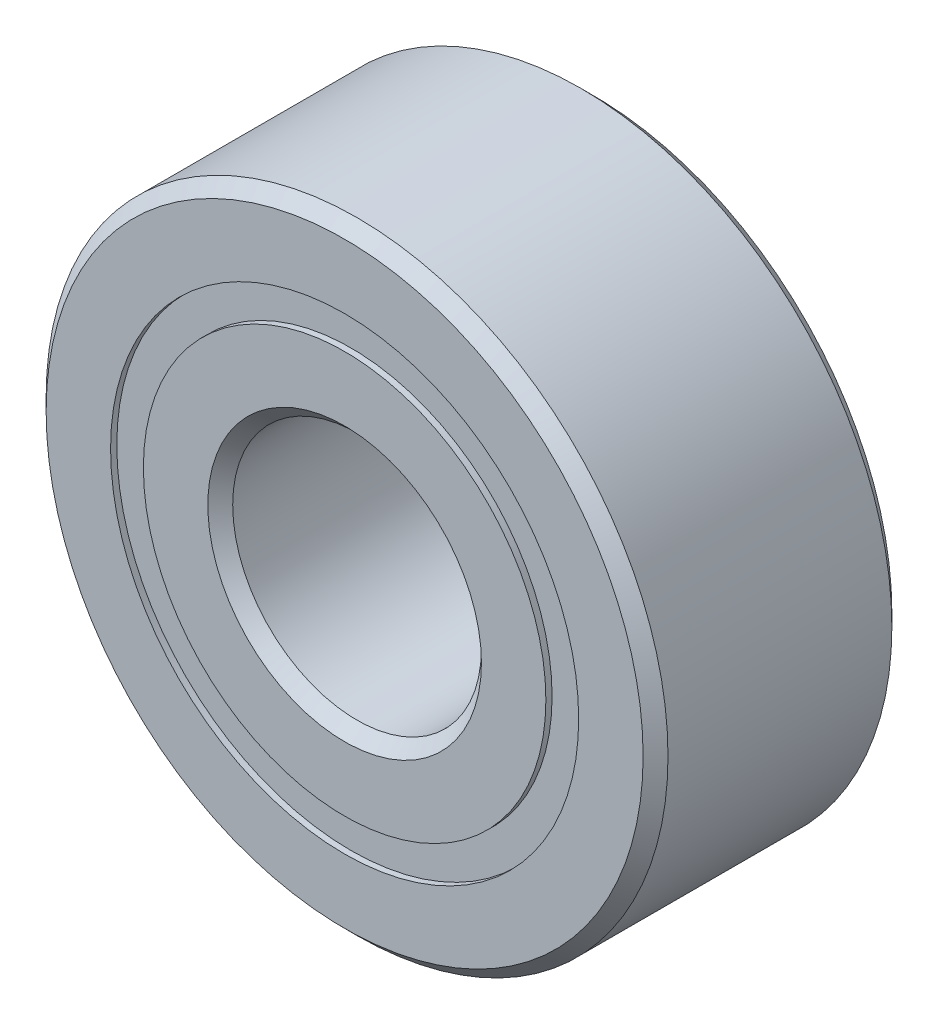
ISO-10303-21;
HEADER;
FILE_DESCRIPTION(('STEP AP214'),'2;1');
FILE_NAME('part.step','',(''),(''),'','','');
FILE_SCHEMA(('AUTOMOTIVE_DESIGN { 1 0 10303 214 1 1 1 1 }'));
ENDSEC;
DATA;
#1=APPLICATION_CONTEXT('core data for automotive mechanical design processes');
#2=APPLICATION_PROTOCOL_DEFINITION('international standard','automotive_design',2000,#1);
#3=PRODUCT_CONTEXT('',#1,'mechanical');
#4=PRODUCT('Part','Part','',(#3));
#5=PRODUCT_RELATED_PRODUCT_CATEGORY('part','',(#4));
#6=PRODUCT_DEFINITION_FORMATION('','',#4);
#7=PRODUCT_DEFINITION_CONTEXT('part definition',#1,'design');
#8=PRODUCT_DEFINITION('design','',#6,#7);
#9=PRODUCT_DEFINITION_SHAPE('','',#8);
#10=(LENGTH_UNIT() NAMED_UNIT(*) SI_UNIT(.MILLI.,.METRE.));
#11=(NAMED_UNIT(*) PLANE_ANGLE_UNIT() SI_UNIT($,.RADIAN.));
#12=(NAMED_UNIT(*) SI_UNIT($,.STERADIAN.) SOLID_ANGLE_UNIT());
#13=UNCERTAINTY_MEASURE_WITH_UNIT(LENGTH_MEASURE(1.E-05),#10,'distance_accuracy_value','');
#14=(GEOMETRIC_REPRESENTATION_CONTEXT(3) GLOBAL_UNCERTAINTY_ASSIGNED_CONTEXT((#13)) GLOBAL_UNIT_ASSIGNED_CONTEXT((#10,
#11,#12)) REPRESENTATION_CONTEXT('',''));
#15=CARTESIAN_POINT('',(0.,0.,0.));
#16=DIRECTION('',(0.,0.,1.));
#17=DIRECTION('',(1.,0.,0.));
#18=AXIS2_PLACEMENT_3D('',#15,#16,#17);
#19=CARTESIAN_POINT('',(0.,3.76373626373626,-1.9));
#20=DIRECTION('',(0.,0.,1.));
#21=DIRECTION('',(1.,0.,0.));
#22=AXIS2_PLACEMENT_3D('',#19,#20,#21);
#23=PLANE('',#22);
#24=CARTESIAN_POINT('',(0.,0.,-1.9));
#25=DIRECTION('',(0.,0.,1.));
#26=DIRECTION('',(1.,0.,0.));
#27=AXIS2_PLACEMENT_3D('',#24,#25,#26);
#28=CIRCLE('',#27,3.76373626373626);
#29=CARTESIAN_POINT('',(3.76373626373626,0.,-1.9));
#30=VERTEX_POINT('',#29);
#31=EDGE_CURVE('E57',#30,#30,#28,.T.);
#32=ORIENTED_EDGE('',*,*,#31,.F.);
#33=EDGE_LOOP('',(#32));
#34=FACE_BOUND('',#33,.T.);
#35=CARTESIAN_POINT('',(0.,0.,-1.9));
#36=DIRECTION('',(0.,0.,1.));
#37=DIRECTION('',(1.,0.,0.));
#38=AXIS2_PLACEMENT_3D('',#35,#36,#37);
#39=CIRCLE('',#38,3.23626373626374);
#40=CARTESIAN_POINT('',(3.23626373626374,0.,-1.9));
#41=VERTEX_POINT('',#40);
#42=EDGE_CURVE('E11',#41,#41,#39,.T.);
#43=ORIENTED_EDGE('',*,*,#42,.T.);
#44=EDGE_LOOP('',(#43));
#45=FACE_BOUND('',#44,.T.);
#46=ADVANCED_FACE('F43',(#34,#45),#23,.F.);
#47=CARTESIAN_POINT('',(0.,0.,2.));
#48=DIRECTION('',(0.,0.,1.));
#49=DIRECTION('',(1.,0.,0.));
#50=AXIS2_PLACEMENT_3D('',#47,#48,#49);
#51=CYLINDRICAL_SURFACE('',#50,3.23626373626374);
#52=ORIENTED_EDGE('',*,*,#42,.F.);
#53=EDGE_LOOP('',(#52));
#54=FACE_BOUND('',#53,.T.);
#55=CARTESIAN_POINT('',(0.,0.,-0.927189448602435));
#56=DIRECTION('',(0.,0.,1.));
#57=DIRECTION('',(1.,0.,0.));
#58=AXIS2_PLACEMENT_3D('',#55,#56,#57);
#59=CIRCLE('',#58,3.23626373626374);
#60=CARTESIAN_POINT('',(3.23626373626374,0.,-0.927189448602435));
#61=VERTEX_POINT('',#60);
#62=EDGE_CURVE('E49',#61,#61,#59,.T.);
#63=ORIENTED_EDGE('',*,*,#62,.T.);
#64=EDGE_LOOP('',(#63));
#65=FACE_BOUND('',#64,.T.);
#66=ADVANCED_FACE('F66',(#54,#65),#51,.F.);
#67=CARTESIAN_POINT('',(0.,3.76373626373626,-0.927189448602435));
#68=DIRECTION('',(0.,0.,-1.));
#69=DIRECTION('',(-1.,0.,0.));
#70=AXIS2_PLACEMENT_3D('',#67,#68,#69);
#71=PLANE('',#70);
#72=ORIENTED_EDGE('',*,*,#62,.F.);
#73=EDGE_LOOP('',(#72));
#74=FACE_BOUND('',#73,.T.);
#75=CARTESIAN_POINT('',(0.,0.,-0.927189448602435));
#76=DIRECTION('',(0.,0.,1.));
#77=DIRECTION('',(1.,0.,0.));
#78=AXIS2_PLACEMENT_3D('',#75,#76,#77);
#79=CIRCLE('',#78,3.76373626373626);
#80=CARTESIAN_POINT('',(3.76373626373626,0.,-0.927189448602435));
#81=VERTEX_POINT('',#80);
#82=EDGE_CURVE('E53',#81,#81,#79,.T.);
#83=ORIENTED_EDGE('',*,*,#82,.T.);
#84=EDGE_LOOP('',(#83));
#85=FACE_BOUND('',#84,.T.);
#86=ADVANCED_FACE('F70',(#74,#85),#71,.F.);
#87=CARTESIAN_POINT('',(0.,0.,2.));
#88=DIRECTION('',(0.,0.,1.));
#89=DIRECTION('',(1.,0.,0.));
#90=AXIS2_PLACEMENT_3D('',#87,#88,#89);
#91=CYLINDRICAL_SURFACE('',#90,3.76373626373626);
#92=ORIENTED_EDGE('',*,*,#82,.F.);
#93=EDGE_LOOP('',(#92));
#94=FACE_BOUND('',#93,.T.);
#95=ORIENTED_EDGE('',*,*,#31,.T.);
#96=EDGE_LOOP('',(#95));
#97=FACE_BOUND('',#96,.T.);
#98=ADVANCED_FACE('F63',(#94,#97),#91,.T.);
#99=CLOSED_SHELL('',(#46,#66,#86,#98));
#100=MANIFOLD_SOLID_BREP('B2',#99);
#101=CARTESIAN_POINT('',(0.,3.76373626373626,1.9));
#102=DIRECTION('',(0.,0.,-1.));
#103=DIRECTION('',(-1.,0.,0.));
#104=AXIS2_PLACEMENT_3D('',#101,#102,#103);
#105=PLANE('',#104);
#106=CARTESIAN_POINT('',(0.,0.,1.9));
#107=DIRECTION('',(0.,0.,1.));
#108=DIRECTION('',(1.,0.,0.));
#109=AXIS2_PLACEMENT_3D('',#106,#107,#108);
#110=CIRCLE('',#109,3.23626373626374);
#111=CARTESIAN_POINT('',(3.23626373626374,0.,1.9));
#112=VERTEX_POINT('',#111);
#113=EDGE_CURVE('E42',#112,#112,#110,.T.);
#114=ORIENTED_EDGE('',*,*,#113,.F.);
#115=EDGE_LOOP('',(#114));
#116=FACE_BOUND('',#115,.T.);
#117=CARTESIAN_POINT('',(0.,0.,1.9));
#118=DIRECTION('',(0.,0.,1.));
#119=DIRECTION('',(1.,0.,0.));
#120=AXIS2_PLACEMENT_3D('',#117,#118,#119);
#121=CIRCLE('',#120,3.76373626373626);
#122=CARTESIAN_POINT('',(3.76373626373626,0.,1.9));
#123=VERTEX_POINT('',#122);
#124=EDGE_CURVE('E124',#123,#123,#121,.T.);
#125=ORIENTED_EDGE('',*,*,#124,.T.);
#126=EDGE_LOOP('',(#125));
#127=FACE_BOUND('',#126,.T.);
#128=ADVANCED_FACE('F110',(#116,#127),#105,.F.);
#129=CARTESIAN_POINT('',(0.,0.,2.));
#130=DIRECTION('',(0.,0.,1.));
#131=DIRECTION('',(1.,0.,0.));
#132=AXIS2_PLACEMENT_3D('',#129,#130,#131);
#133=CYLINDRICAL_SURFACE('',#132,3.23626373626374);
#134=CARTESIAN_POINT('',(0.,0.,0.927189448602435));
#135=DIRECTION('',(0.,0.,1.));
#136=DIRECTION('',(1.,0.,0.));
#137=AXIS2_PLACEMENT_3D('',#134,#135,#136);
#138=CIRCLE('',#137,3.23626373626374);
#139=CARTESIAN_POINT('',(3.23626373626374,0.,0.927189448602435));
#140=VERTEX_POINT('',#139);
#141=EDGE_CURVE('E116',#140,#140,#138,.T.);
#142=ORIENTED_EDGE('',*,*,#141,.F.);
#143=EDGE_LOOP('',(#142));
#144=FACE_BOUND('',#143,.T.);
#145=ORIENTED_EDGE('',*,*,#113,.T.);
#146=EDGE_LOOP('',(#145));
#147=FACE_BOUND('',#146,.T.);
#148=ADVANCED_FACE('F139',(#144,#147),#133,.F.);
#149=CARTESIAN_POINT('',(0.,3.76373626373626,0.927189448602435));
#150=DIRECTION('',(0.,0.,1.));
#151=DIRECTION('',(1.,0.,0.));
#152=AXIS2_PLACEMENT_3D('',#149,#150,#151);
#153=PLANE('',#152);
#154=CARTESIAN_POINT('',(0.,0.,0.927189448602435));
#155=DIRECTION('',(0.,0.,1.));
#156=DIRECTION('',(1.,0.,0.));
#157=AXIS2_PLACEMENT_3D('',#154,#155,#156);
#158=CIRCLE('',#157,3.76373626373626);
#159=CARTESIAN_POINT('',(3.76373626373626,0.,0.927189448602435));
#160=VERTEX_POINT('',#159);
#161=EDGE_CURVE('E120',#160,#160,#158,.T.);
#162=ORIENTED_EDGE('',*,*,#161,.F.);
#163=EDGE_LOOP('',(#162));
#164=FACE_BOUND('',#163,.T.);
#165=ORIENTED_EDGE('',*,*,#141,.T.);
#166=EDGE_LOOP('',(#165));
#167=FACE_BOUND('',#166,.T.);
#168=ADVANCED_FACE('F134',(#164,#167),#153,.F.);
#169=CARTESIAN_POINT('',(0.,0.,2.));
#170=DIRECTION('',(0.,0.,1.));
#171=DIRECTION('',(1.,0.,0.));
#172=AXIS2_PLACEMENT_3D('',#169,#170,#171);
#173=CYLINDRICAL_SURFACE('',#172,3.76373626373626);
#174=ORIENTED_EDGE('',*,*,#124,.F.);
#175=EDGE_LOOP('',(#174));
#176=FACE_BOUND('',#175,.T.);
#177=ORIENTED_EDGE('',*,*,#161,.T.);
#178=EDGE_LOOP('',(#177));
#179=FACE_BOUND('',#178,.T.);
#180=ADVANCED_FACE('F131',(#176,#179),#173,.T.);
#181=CLOSED_SHELL('',(#128,#148,#168,#180));
#182=MANIFOLD_SOLID_BREP('B6',#181);
#183=CARTESIAN_POINT('',(-1.74999999999996,3.03108891324556,0.));
#184=DIRECTION('',(0.,0.,1.));
#185=DIRECTION('',(-0.499999999999989,0.866025403784445,0.));
#186=AXIS2_PLACEMENT_3D('',#183,#184,#185);
#187=SPHERICAL_SURFACE('',#186,0.927189448602435);
#188=CARTESIAN_POINT('',(-1.74999999999996,3.03108891324556,0.927189448602435));
#189=VERTEX_POINT('',#188);
#190=VERTEX_LOOP('',#189);
#191=FACE_BOUND('',#190,.T.);
#192=ADVANCED_FACE('F177',(#191),#187,.T.);
#193=CLOSED_SHELL('',(#192));
#194=MANIFOLD_SOLID_BREP('B37',#193);
#195=CARTESIAN_POINT('',(-3.03108891324552,1.75000000000004,0.));
#196=DIRECTION('',(0.,0.,1.));
#197=DIRECTION('',(-0.866025403784433,0.50000000000001,0.));
#198=AXIS2_PLACEMENT_3D('',#195,#196,#197);
#199=SPHERICAL_SURFACE('',#198,0.927189448602435);
#200=CARTESIAN_POINT('',(-3.03108891324552,1.75000000000004,0.927189448602435));
#201=VERTEX_POINT('',#200);
#202=VERTEX_LOOP('',#201);
#203=FACE_BOUND('',#202,.T.);
#204=ADVANCED_FACE('F197',(#203),#199,.T.);
#205=CLOSED_SHELL('',(#204));
#206=MANIFOLD_SOLID_BREP('B106',#205);
#207=CARTESIAN_POINT('',(-3.5,0.,0.));
#208=DIRECTION('',(0.,0.,1.));
#209=DIRECTION('',(-1.,0.,0.));
#210=AXIS2_PLACEMENT_3D('',#207,#208,#209);
#211=SPHERICAL_SURFACE('',#210,0.927189448602435);
#212=CARTESIAN_POINT('',(-3.5,0.,0.927189448602435));
#213=VERTEX_POINT('',#212);
#214=VERTEX_LOOP('',#213);
#215=FACE_BOUND('',#214,.T.);
#216=ADVANCED_FACE('F217',(#215),#211,.T.);
#217=CLOSED_SHELL('',(#216));
#218=MANIFOLD_SOLID_BREP('B173',#217);
#219=CARTESIAN_POINT('',(-3.03108891324555,-1.74999999999997,0.));
#220=DIRECTION('',(0.,0.,1.));
#221=DIRECTION('',(-0.866025403784443,-0.499999999999992,0.));
#222=AXIS2_PLACEMENT_3D('',#219,#220,#221);
#223=SPHERICAL_SURFACE('',#222,0.927189448602435);
#224=CARTESIAN_POINT('',(-3.03108891324555,-1.74999999999997,0.927189448602435));
#225=VERTEX_POINT('',#224);
#226=VERTEX_LOOP('',#225);
#227=FACE_BOUND('',#226,.T.);
#228=ADVANCED_FACE('F237',(#227),#223,.T.);
#229=CLOSED_SHELL('',(#228));
#230=MANIFOLD_SOLID_BREP('B193',#229);
#231=CARTESIAN_POINT('',(-1.75000000000002,-3.03108891324552,0.));
#232=DIRECTION('',(0.,0.,1.));
#233=DIRECTION('',(-0.500000000000007,-0.866025403784435,0.));
#234=AXIS2_PLACEMENT_3D('',#231,#232,#233);
#235=SPHERICAL_SURFACE('',#234,0.927189448602435);
#236=CARTESIAN_POINT('',(-1.75000000000002,-3.03108891324552,0.927189448602435));
#237=VERTEX_POINT('',#236);
#238=VERTEX_LOOP('',#237);
#239=FACE_BOUND('',#238,.T.);
#240=ADVANCED_FACE('F257',(#239),#235,.T.);
#241=CLOSED_SHELL('',(#240));
#242=MANIFOLD_SOLID_BREP('B213',#241);
#243=CARTESIAN_POINT('',(0.,-3.5,0.));
#244=DIRECTION('',(0.,0.,1.));
#245=DIRECTION('',(0.,-1.,0.));
#246=AXIS2_PLACEMENT_3D('',#243,#244,#245);
#247=SPHERICAL_SURFACE('',#246,0.927189448602435);
#248=CARTESIAN_POINT('',(0.,-3.5,0.927189448602435));
#249=VERTEX_POINT('',#248);
#250=VERTEX_LOOP('',#249);
#251=FACE_BOUND('',#250,.T.);
#252=ADVANCED_FACE('F277',(#251),#247,.T.);
#253=CLOSED_SHELL('',(#252));
#254=MANIFOLD_SOLID_BREP('B233',#253);
#255=CARTESIAN_POINT('',(1.74999999999998,-3.03108891324555,0.));
#256=DIRECTION('',(0.,0.,1.));
#257=DIRECTION('',(0.499999999999995,-0.866025403784442,0.));
#258=AXIS2_PLACEMENT_3D('',#255,#256,#257);
#259=SPHERICAL_SURFACE('',#258,0.927189448602435);
#260=CARTESIAN_POINT('',(1.74999999999998,-3.03108891324555,0.927189448602435));
#261=VERTEX_POINT('',#260);
#262=VERTEX_LOOP('',#261);
#263=FACE_BOUND('',#262,.T.);
#264=ADVANCED_FACE('F297',(#263),#259,.T.);
#265=CLOSED_SHELL('',(#264));
#266=MANIFOLD_SOLID_BREP('B253',#265);
#267=CARTESIAN_POINT('',(3.03108891324553,-1.75000000000001,0.));
#268=DIRECTION('',(0.,0.,1.));
#269=DIRECTION('',(0.866025403784436,-0.500000000000004,0.));
#270=AXIS2_PLACEMENT_3D('',#267,#268,#269);
#271=SPHERICAL_SURFACE('',#270,0.927189448602435);
#272=CARTESIAN_POINT('',(3.03108891324553,-1.75000000000001,0.927189448602435));
#273=VERTEX_POINT('',#272);
#274=VERTEX_LOOP('',#273);
#275=FACE_BOUND('',#274,.T.);
#276=ADVANCED_FACE('F317',(#275),#271,.T.);
#277=CLOSED_SHELL('',(#276));
#278=MANIFOLD_SOLID_BREP('B273',#277);
#279=CARTESIAN_POINT('',(3.5,0.,0.));
#280=DIRECTION('',(0.,0.,1.));
#281=DIRECTION('',(1.,0.,0.));
#282=AXIS2_PLACEMENT_3D('',#279,#280,#281);
#283=SPHERICAL_SURFACE('',#282,0.927189448602435);
#284=CARTESIAN_POINT('',(3.5,0.,0.927189448602435));
#285=VERTEX_POINT('',#284);
#286=VERTEX_LOOP('',#285);
#287=FACE_BOUND('',#286,.T.);
#288=ADVANCED_FACE('F337',(#287),#283,.T.);
#289=CLOSED_SHELL('',(#288));
#290=MANIFOLD_SOLID_BREP('B293',#289);
#291=CARTESIAN_POINT('',(3.03108891324554,1.74999999999999,0.));
#292=DIRECTION('',(0.,0.,1.));
#293=DIRECTION('',(0.86602540378444,0.499999999999998,0.));
#294=AXIS2_PLACEMENT_3D('',#291,#292,#293);
#295=SPHERICAL_SURFACE('',#294,0.927189448602435);
#296=CARTESIAN_POINT('',(3.03108891324554,1.74999999999999,0.927189448602435));
#297=VERTEX_POINT('',#296);
#298=VERTEX_LOOP('',#297);
#299=FACE_BOUND('',#298,.T.);
#300=ADVANCED_FACE('F357',(#299),#295,.T.);
#301=CLOSED_SHELL('',(#300));
#302=MANIFOLD_SOLID_BREP('B313',#301);
#303=CARTESIAN_POINT('',(1.75,3.03108891324553,0.));
#304=DIRECTION('',(0.,0.,1.));
#305=DIRECTION('',(0.500000000000001,0.866025403784438,0.));
#306=AXIS2_PLACEMENT_3D('',#303,#304,#305);
#307=SPHERICAL_SURFACE('',#306,0.927189448602435);
#308=CARTESIAN_POINT('',(1.75,3.03108891324553,0.927189448602435));
#309=VERTEX_POINT('',#308);
#310=VERTEX_LOOP('',#309);
#311=FACE_BOUND('',#310,.T.);
#312=ADVANCED_FACE('F377',(#311),#307,.T.);
#313=CLOSED_SHELL('',(#312));
#314=MANIFOLD_SOLID_BREP('B333',#313);
#315=CARTESIAN_POINT('',(0.,3.5,0.));
#316=DIRECTION('',(0.,0.,1.));
#317=DIRECTION('',(0.,1.,0.));
#318=AXIS2_PLACEMENT_3D('',#315,#316,#317);
#319=SPHERICAL_SURFACE('',#318,0.927189448602435);
#320=CARTESIAN_POINT('',(0.,3.5,0.927189448602435));
#321=VERTEX_POINT('',#320);
#322=VERTEX_LOOP('',#321);
#323=FACE_BOUND('',#322,.T.);
#324=ADVANCED_FACE('F399',(#323),#319,.T.);
#325=CLOSED_SHELL('',(#324));
#326=MANIFOLD_SOLID_BREP('B353',#325);
#327=CARTESIAN_POINT('',(0.,3.23626373626374,2.));
#328=DIRECTION('',(0.,0.,-1.));
#329=DIRECTION('',(-1.,0.,0.));
#330=AXIS2_PLACEMENT_3D('',#327,#328,#329);
#331=PLANE('',#330);
#332=CARTESIAN_POINT('',(0.,0.,2.));
#333=DIRECTION('',(0.,0.,1.));
#334=DIRECTION('',(1.,0.,0.));
#335=AXIS2_PLACEMENT_3D('',#332,#333,#334);
#336=CIRCLE('',#335,2.2);
#337=CARTESIAN_POINT('',(2.2,0.,2.));
#338=VERTEX_POINT('',#337);
#339=EDGE_CURVE('E446',#338,#338,#336,.T.);
#340=ORIENTED_EDGE('',*,*,#339,.F.);
#341=EDGE_LOOP('',(#340));
#342=FACE_BOUND('',#341,.T.);
#343=CARTESIAN_POINT('',(0.,0.,2.));
#344=DIRECTION('',(0.,0.,1.));
#345=DIRECTION('',(1.,0.,0.));
#346=AXIS2_PLACEMENT_3D('',#343,#344,#345);
#347=CIRCLE('',#346,3.23626373626374);
#348=CARTESIAN_POINT('',(3.23626373626374,0.,2.));
#349=VERTEX_POINT('',#348);
#350=EDGE_CURVE('E398',#349,#349,#347,.T.);
#351=ORIENTED_EDGE('',*,*,#350,.T.);
#352=EDGE_LOOP('',(#351));
#353=FACE_BOUND('',#352,.T.);
#354=ADVANCED_FACE('F418',(#342,#353),#331,.F.);
#355=CARTESIAN_POINT('',(0.,0.,2.));
#356=DIRECTION('',(0.,0.,1.));
#357=DIRECTION('',(1.,0.,0.));
#358=AXIS2_PLACEMENT_3D('',#355,#356,#357);
#359=CYLINDRICAL_SURFACE('',#358,3.23626373626374);
#360=ORIENTED_EDGE('',*,*,#350,.F.);
#361=EDGE_LOOP('',(#360));
#362=FACE_BOUND('',#361,.T.);
#363=CARTESIAN_POINT('',(0.,0.,0.888888888888889));
#364=DIRECTION('',(0.,0.,1.));
#365=DIRECTION('',(1.,0.,0.));
#366=AXIS2_PLACEMENT_3D('',#363,#364,#365);
#367=CIRCLE('',#366,3.23626373626374);
#368=CARTESIAN_POINT('',(3.23626373626374,0.,0.888888888888889));
#369=VERTEX_POINT('',#368);
#370=EDGE_CURVE('E424',#369,#369,#367,.T.);
#371=ORIENTED_EDGE('',*,*,#370,.T.);
#372=EDGE_LOOP('',(#371));
#373=FACE_BOUND('',#372,.T.);
#374=ADVANCED_FACE('F453',(#362,#373),#359,.T.);
#375=CARTESIAN_POINT('',(0.,0.,0.));
#376=DIRECTION('',(0.,0.,1.));
#377=DIRECTION('',(1.,0.,0.));
#378=AXIS2_PLACEMENT_3D('',#375,#376,#377);
#379=TOROIDAL_SURFACE('',#378,3.5,0.927189448602434);
#380=ORIENTED_EDGE('',*,*,#370,.F.);
#381=EDGE_LOOP('',(#380));
#382=FACE_BOUND('',#381,.T.);
#383=CARTESIAN_POINT('',(0.,0.,-0.88888888888889));
#384=DIRECTION('',(0.,0.,1.));
#385=DIRECTION('',(1.,0.,0.));
#386=AXIS2_PLACEMENT_3D('',#383,#384,#385);
#387=CIRCLE('',#386,3.23626373626374);
#388=CARTESIAN_POINT('',(3.23626373626374,0.,-0.88888888888889));
#389=VERTEX_POINT('',#388);
#390=EDGE_CURVE('E428',#389,#389,#387,.T.);
#391=ORIENTED_EDGE('',*,*,#390,.T.);
#392=EDGE_LOOP('',(#391));
#393=FACE_BOUND('',#392,.T.);
#394=ADVANCED_FACE('F457',(#382,#393),#379,.F.);
#395=CARTESIAN_POINT('',(0.,0.,2.));
#396=DIRECTION('',(0.,0.,1.));
#397=DIRECTION('',(1.,0.,0.));
#398=AXIS2_PLACEMENT_3D('',#395,#396,#397);
#399=CYLINDRICAL_SURFACE('',#398,3.23626373626374);
#400=ORIENTED_EDGE('',*,*,#390,.F.);
#401=EDGE_LOOP('',(#400));
#402=FACE_BOUND('',#401,.T.);
#403=CARTESIAN_POINT('',(0.,0.,-2.));
#404=DIRECTION('',(0.,0.,1.));
#405=DIRECTION('',(1.,0.,0.));
#406=AXIS2_PLACEMENT_3D('',#403,#404,#405);
#407=CIRCLE('',#406,3.23626373626374);
#408=CARTESIAN_POINT('',(3.23626373626374,0.,-2.));
#409=VERTEX_POINT('',#408);
#410=EDGE_CURVE('E432',#409,#409,#407,.T.);
#411=ORIENTED_EDGE('',*,*,#410,.T.);
#412=EDGE_LOOP('',(#411));
#413=FACE_BOUND('',#412,.T.);
#414=ADVANCED_FACE('F462',(#402,#413),#399,.T.);
#415=CARTESIAN_POINT('',(0.,2.2,-2.));
#416=DIRECTION('',(0.,0.,1.));
#417=DIRECTION('',(1.,0.,0.));
#418=AXIS2_PLACEMENT_3D('',#415,#416,#417);
#419=PLANE('',#418);
#420=ORIENTED_EDGE('',*,*,#410,.F.);
#421=EDGE_LOOP('',(#420));
#422=FACE_BOUND('',#421,.T.);
#423=CARTESIAN_POINT('',(0.,0.,-2.));
#424=DIRECTION('',(0.,0.,1.));
#425=DIRECTION('',(1.,0.,0.));
#426=AXIS2_PLACEMENT_3D('',#423,#424,#425);
#427=CIRCLE('',#426,2.2);
#428=CARTESIAN_POINT('',(2.2,0.,-2.));
#429=VERTEX_POINT('',#428);
#430=EDGE_CURVE('E437',#429,#429,#427,.T.);
#431=ORIENTED_EDGE('',*,*,#430,.T.);
#432=EDGE_LOOP('',(#431));
#433=FACE_BOUND('',#432,.T.);
#434=ADVANCED_FACE('F468',(#422,#433),#419,.F.);
#435=CARTESIAN_POINT('',(0.,0.,-1.8));
#436=DIRECTION('',(0.,0.,-1.));
#437=DIRECTION('',(-1.,0.,0.));
#438=AXIS2_PLACEMENT_3D('',#435,#436,#437);
#439=CONICAL_SURFACE('',#438,2.,0.785398163397443);
#440=ORIENTED_EDGE('',*,*,#430,.F.);
#441=EDGE_LOOP('',(#440));
#442=FACE_BOUND('',#441,.T.);
#443=CARTESIAN_POINT('',(0.,0.,-1.8));
#444=DIRECTION('',(0.,0.,1.));
#445=DIRECTION('',(1.,0.,0.));
#446=AXIS2_PLACEMENT_3D('',#443,#444,#445);
#447=CIRCLE('',#446,2.);
#448=CARTESIAN_POINT('',(2.,0.,-1.8));
#449=VERTEX_POINT('',#448);
#450=EDGE_CURVE('E440',#449,#449,#447,.T.);
#451=ORIENTED_EDGE('',*,*,#450,.T.);
#452=EDGE_LOOP('',(#451));
#453=FACE_BOUND('',#452,.T.);
#454=ADVANCED_FACE('F472',(#442,#453),#439,.F.);
#455=CARTESIAN_POINT('',(0.,0.,2.));
#456=DIRECTION('',(0.,0.,1.));
#457=DIRECTION('',(1.,0.,0.));
#458=AXIS2_PLACEMENT_3D('',#455,#456,#457);
#459=CYLINDRICAL_SURFACE('',#458,2.);
#460=ORIENTED_EDGE('',*,*,#450,.F.);
#461=EDGE_LOOP('',(#460));
#462=FACE_BOUND('',#461,.T.);
#463=CARTESIAN_POINT('',(0.,0.,1.8));
#464=DIRECTION('',(0.,0.,1.));
#465=DIRECTION('',(1.,0.,0.));
#466=AXIS2_PLACEMENT_3D('',#463,#464,#465);
#467=CIRCLE('',#466,2.);
#468=CARTESIAN_POINT('',(2.,0.,1.8));
#469=VERTEX_POINT('',#468);
#470=EDGE_CURVE('E443',#469,#469,#467,.T.);
#471=ORIENTED_EDGE('',*,*,#470,.T.);
#472=EDGE_LOOP('',(#471));
#473=FACE_BOUND('',#472,.T.);
#474=ADVANCED_FACE('F476',(#462,#473),#459,.F.);
#475=CARTESIAN_POINT('',(0.,0.,2.));
#476=DIRECTION('',(0.,0.,1.));
#477=DIRECTION('',(1.,0.,0.));
#478=AXIS2_PLACEMENT_3D('',#475,#476,#477);
#479=CONICAL_SURFACE('',#478,2.2,0.785398163397454);
#480=ORIENTED_EDGE('',*,*,#470,.F.);
#481=EDGE_LOOP('',(#480));
#482=FACE_BOUND('',#481,.T.);
#483=ORIENTED_EDGE('',*,*,#339,.T.);
#484=EDGE_LOOP('',(#483));
#485=FACE_BOUND('',#484,.T.);
#486=ADVANCED_FACE('F450',(#482,#485),#479,.F.);
#487=CLOSED_SHELL('',(#354,#374,#394,#414,#434,#454,#474,#486));
#488=MANIFOLD_SOLID_BREP('B373',#487);
#489=CARTESIAN_POINT('',(0.,0.,1.8));
#490=DIRECTION('',(0.,0.,-1.));
#491=DIRECTION('',(-1.,0.,0.));
#492=AXIS2_PLACEMENT_3D('',#489,#490,#491);
#493=CONICAL_SURFACE('',#492,5.,0.785398163397445);
#494=CARTESIAN_POINT('',(0.,0.,2.));
#495=DIRECTION('',(0.,0.,1.));
#496=DIRECTION('',(1.,0.,0.));
#497=AXIS2_PLACEMENT_3D('',#494,#495,#496);
#498=CIRCLE('',#497,4.8);
#499=CARTESIAN_POINT('',(4.8,0.,2.));
#500=VERTEX_POINT('',#499);
#501=EDGE_CURVE('E567',#500,#500,#498,.T.);
#502=ORIENTED_EDGE('',*,*,#501,.F.);
#503=EDGE_LOOP('',(#502));
#504=FACE_BOUND('',#503,.T.);
#505=CARTESIAN_POINT('',(0.,0.,1.8));
#506=DIRECTION('',(0.,0.,1.));
#507=DIRECTION('',(1.,0.,0.));
#508=AXIS2_PLACEMENT_3D('',#505,#506,#507);
#509=CIRCLE('',#508,5.);
#510=CARTESIAN_POINT('',(5.,0.,1.8));
#511=VERTEX_POINT('',#510);
#512=EDGE_CURVE('E417',#511,#511,#509,.T.);
#513=ORIENTED_EDGE('',*,*,#512,.T.);
#514=EDGE_LOOP('',(#513));
#515=FACE_BOUND('',#514,.T.);
#516=ADVANCED_FACE('F539',(#504,#515),#493,.T.);
#517=CARTESIAN_POINT('',(0.,0.,2.));
#518=DIRECTION('',(0.,0.,1.));
#519=DIRECTION('',(1.,0.,0.));
#520=AXIS2_PLACEMENT_3D('',#517,#518,#519);
#521=CYLINDRICAL_SURFACE('',#520,5.);
#522=ORIENTED_EDGE('',*,*,#512,.F.);
#523=EDGE_LOOP('',(#522));
#524=FACE_BOUND('',#523,.T.);
#525=CARTESIAN_POINT('',(0.,0.,-1.8));
#526=DIRECTION('',(0.,0.,1.));
#527=DIRECTION('',(1.,0.,0.));
#528=AXIS2_PLACEMENT_3D('',#525,#526,#527);
#529=CIRCLE('',#528,5.);
#530=CARTESIAN_POINT('',(5.,0.,-1.8));
#531=VERTEX_POINT('',#530);
#532=EDGE_CURVE('E545',#531,#531,#529,.T.);
#533=ORIENTED_EDGE('',*,*,#532,.T.);
#534=EDGE_LOOP('',(#533));
#535=FACE_BOUND('',#534,.T.);
#536=ADVANCED_FACE('F574',(#524,#535),#521,.T.);
#537=CARTESIAN_POINT('',(0.,0.,-2.));
#538=DIRECTION('',(0.,0.,1.));
#539=DIRECTION('',(1.,0.,0.));
#540=AXIS2_PLACEMENT_3D('',#537,#538,#539);
#541=CONICAL_SURFACE('',#540,4.8,0.785398163397444);
#542=ORIENTED_EDGE('',*,*,#532,.F.);
#543=EDGE_LOOP('',(#542));
#544=FACE_BOUND('',#543,.T.);
#545=CARTESIAN_POINT('',(0.,0.,-2.));
#546=DIRECTION('',(0.,0.,1.));
#547=DIRECTION('',(1.,0.,0.));
#548=AXIS2_PLACEMENT_3D('',#545,#546,#547);
#549=CIRCLE('',#548,4.8);
#550=CARTESIAN_POINT('',(4.8,0.,-2.));
#551=VERTEX_POINT('',#550);
#552=EDGE_CURVE('E549',#551,#551,#549,.T.);
#553=ORIENTED_EDGE('',*,*,#552,.T.);
#554=EDGE_LOOP('',(#553));
#555=FACE_BOUND('',#554,.T.);
#556=ADVANCED_FACE('F578',(#544,#555),#541,.T.);
#557=CARTESIAN_POINT('',(0.,4.8,-2.));
#558=DIRECTION('',(0.,0.,1.));
#559=DIRECTION('',(1.,0.,0.));
#560=AXIS2_PLACEMENT_3D('',#557,#558,#559);
#561=PLANE('',#560);
#562=ORIENTED_EDGE('',*,*,#552,.F.);
#563=EDGE_LOOP('',(#562));
#564=FACE_BOUND('',#563,.T.);
#565=CARTESIAN_POINT('',(0.,0.,-2.));
#566=DIRECTION('',(0.,0.,1.));
#567=DIRECTION('',(1.,0.,0.));
#568=AXIS2_PLACEMENT_3D('',#565,#566,#567);
#569=CIRCLE('',#568,3.76373626373626);
#570=CARTESIAN_POINT('',(3.76373626373626,0.,-2.));
#571=VERTEX_POINT('',#570);
#572=EDGE_CURVE('E553',#571,#571,#569,.T.);
#573=ORIENTED_EDGE('',*,*,#572,.T.);
#574=EDGE_LOOP('',(#573));
#575=FACE_BOUND('',#574,.T.);
#576=ADVANCED_FACE('F583',(#564,#575),#561,.F.);
#577=CARTESIAN_POINT('',(0.,0.,2.));
#578=DIRECTION('',(0.,0.,1.));
#579=DIRECTION('',(1.,0.,0.));
#580=AXIS2_PLACEMENT_3D('',#577,#578,#579);
#581=CYLINDRICAL_SURFACE('',#580,3.76373626373626);
#582=ORIENTED_EDGE('',*,*,#572,.F.);
#583=EDGE_LOOP('',(#582));
#584=FACE_BOUND('',#583,.T.);
#585=CARTESIAN_POINT('',(0.,0.,-0.888888888888889));
#586=DIRECTION('',(0.,0.,1.));
#587=DIRECTION('',(1.,0.,0.));
#588=AXIS2_PLACEMENT_3D('',#585,#586,#587);
#589=CIRCLE('',#588,3.76373626373626);
#590=CARTESIAN_POINT('',(3.76373626373626,0.,-0.888888888888889));
#591=VERTEX_POINT('',#590);
#592=EDGE_CURVE('E558',#591,#591,#589,.T.);
#593=ORIENTED_EDGE('',*,*,#592,.T.);
#594=EDGE_LOOP('',(#593));
#595=FACE_BOUND('',#594,.T.);
#596=ADVANCED_FACE('F589',(#584,#595),#581,.F.);
#597=CARTESIAN_POINT('',(0.,0.,0.));
#598=DIRECTION('',(0.,0.,1.));
#599=DIRECTION('',(1.,0.,0.));
#600=AXIS2_PLACEMENT_3D('',#597,#598,#599);
#601=TOROIDAL_SURFACE('',#600,3.5,0.927189448602435);
#602=ORIENTED_EDGE('',*,*,#592,.F.);
#603=EDGE_LOOP('',(#602));
#604=FACE_BOUND('',#603,.T.);
#605=CARTESIAN_POINT('',(0.,0.,0.888888888888889));
#606=DIRECTION('',(0.,0.,1.));
#607=DIRECTION('',(1.,0.,0.));
#608=AXIS2_PLACEMENT_3D('',#605,#606,#607);
#609=CIRCLE('',#608,3.76373626373626);
#610=CARTESIAN_POINT('',(3.76373626373626,0.,0.888888888888889));
#611=VERTEX_POINT('',#610);
#612=EDGE_CURVE('E561',#611,#611,#609,.T.);
#613=ORIENTED_EDGE('',*,*,#612,.T.);
#614=EDGE_LOOP('',(#613));
#615=FACE_BOUND('',#614,.T.);
#616=ADVANCED_FACE('F593',(#604,#615),#601,.F.);
#617=CARTESIAN_POINT('',(0.,0.,2.));
#618=DIRECTION('',(0.,0.,1.));
#619=DIRECTION('',(1.,0.,0.));
#620=AXIS2_PLACEMENT_3D('',#617,#618,#619);
#621=CYLINDRICAL_SURFACE('',#620,3.76373626373626);
#622=ORIENTED_EDGE('',*,*,#612,.F.);
#623=EDGE_LOOP('',(#622));
#624=FACE_BOUND('',#623,.T.);
#625=CARTESIAN_POINT('',(0.,0.,2.));
#626=DIRECTION('',(0.,0.,1.));
#627=DIRECTION('',(1.,0.,0.));
#628=AXIS2_PLACEMENT_3D('',#625,#626,#627);
#629=CIRCLE('',#628,3.76373626373626);
#630=CARTESIAN_POINT('',(3.76373626373626,0.,2.));
#631=VERTEX_POINT('',#630);
#632=EDGE_CURVE('E564',#631,#631,#629,.T.);
#633=ORIENTED_EDGE('',*,*,#632,.T.);
#634=EDGE_LOOP('',(#633));
#635=FACE_BOUND('',#634,.T.);
#636=ADVANCED_FACE('F597',(#624,#635),#621,.F.);
#637=CARTESIAN_POINT('',(0.,4.8,2.));
#638=DIRECTION('',(0.,0.,-1.));
#639=DIRECTION('',(-1.,0.,0.));
#640=AXIS2_PLACEMENT_3D('',#637,#638,#639);
#641=PLANE('',#640);
#642=ORIENTED_EDGE('',*,*,#632,.F.);
#643=EDGE_LOOP('',(#642));
#644=FACE_BOUND('',#643,.T.);
#645=ORIENTED_EDGE('',*,*,#501,.T.);
#646=EDGE_LOOP('',(#645));
#647=FACE_BOUND('',#646,.T.);
#648=ADVANCED_FACE('F571',(#644,#647),#641,.F.);
#649=CLOSED_SHELL('',(#516,#536,#556,#576,#596,#616,#636,#648));
#650=MANIFOLD_SOLID_BREP('B393',#649);
#651=ADVANCED_BREP_SHAPE_REPRESENTATION('',(#18,#100,#182,#194,#206,#218,#230,#242,#254,#266,
#278,#290,#302,#314,#326,#488,#650),#14);
#652=SHAPE_DEFINITION_REPRESENTATION(#9,#651);
ENDSEC;
END-ISO-10303-21;
